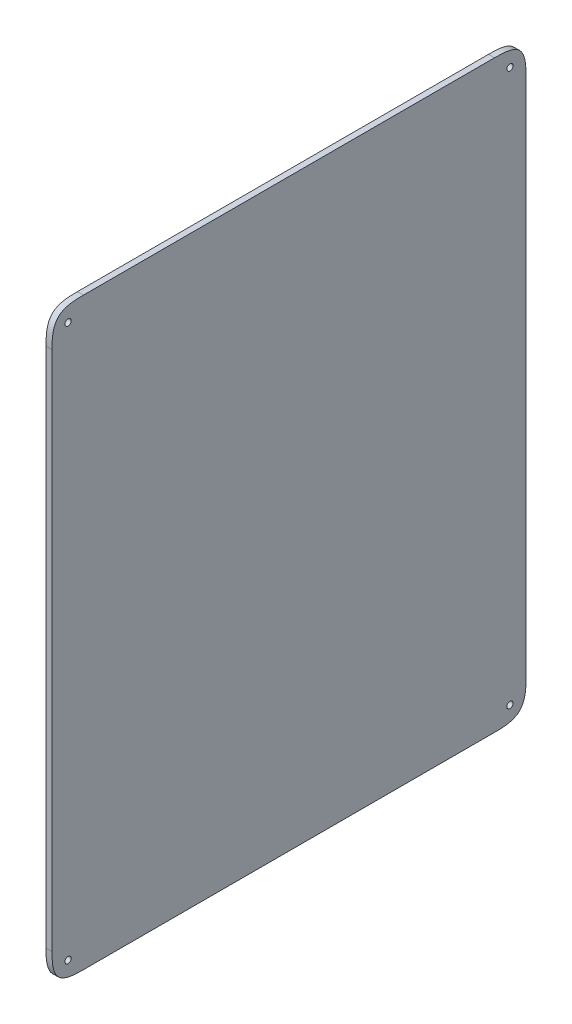
ISO-10303-21;
HEADER;
FILE_DESCRIPTION(('STEP AP214'),'2;1');
FILE_NAME('part.step','',(''),(''),'','','');
FILE_SCHEMA(('AUTOMOTIVE_DESIGN { 1 0 10303 214 1 1 1 1 }'));
ENDSEC;
DATA;
#1=APPLICATION_CONTEXT('core data for automotive mechanical design processes');
#2=APPLICATION_PROTOCOL_DEFINITION('international standard','automotive_design',2000,#1);
#3=PRODUCT_CONTEXT('',#1,'mechanical');
#4=PRODUCT('Part','Part','',(#3));
#5=PRODUCT_RELATED_PRODUCT_CATEGORY('part','',(#4));
#6=PRODUCT_DEFINITION_FORMATION('','',#4);
#7=PRODUCT_DEFINITION_CONTEXT('part definition',#1,'design');
#8=PRODUCT_DEFINITION('design','',#6,#7);
#9=PRODUCT_DEFINITION_SHAPE('','',#8);
#10=(LENGTH_UNIT() NAMED_UNIT(*) SI_UNIT(.MILLI.,.METRE.));
#11=(NAMED_UNIT(*) PLANE_ANGLE_UNIT() SI_UNIT($,.RADIAN.));
#12=(NAMED_UNIT(*) SI_UNIT($,.STERADIAN.) SOLID_ANGLE_UNIT());
#13=UNCERTAINTY_MEASURE_WITH_UNIT(LENGTH_MEASURE(1.E-05),#10,'distance_accuracy_value','');
#14=(GEOMETRIC_REPRESENTATION_CONTEXT(3) GLOBAL_UNCERTAINTY_ASSIGNED_CONTEXT((#13)) GLOBAL_UNIT_ASSIGNED_CONTEXT((#10,
#11,#12)) REPRESENTATION_CONTEXT('',''));
#15=CARTESIAN_POINT('',(0.,0.,0.));
#16=DIRECTION('',(0.,0.,1.));
#17=DIRECTION('',(1.,0.,0.));
#18=AXIS2_PLACEMENT_3D('',#15,#16,#17);
#19=CARTESIAN_POINT('',(134.,260.,-236.399999999949));
#20=CARTESIAN_POINT('',(134.,262.209802254566,-236.399999999949));
#21=CARTESIAN_POINT('',(134.,264.418959698798,-236.391924275158));
#22=CARTESIAN_POINT('',(134.,268.821858168656,-236.182694726137));
#23=CARTESIAN_POINT('',(134.,271.015648283181,-235.982155700431));
#24=CARTESIAN_POINT('',(134.,274.283308196084,-235.392974528868));
#25=CARTESIAN_POINT('',(134.,275.373662547497,-235.148476846611));
#26=CARTESIAN_POINT('',(134.,277.509476267589,-234.544783131068));
#27=CARTESIAN_POINT('',(134.,278.556691748358,-234.185747806904));
#28=CARTESIAN_POINT('',(134.,280.087422813137,-233.536384955998));
#29=CARTESIAN_POINT('',(134.,280.590989349973,-233.301475834499));
#30=CARTESIAN_POINT('',(134.,281.58191965689,-232.786875106502));
#31=CARTESIAN_POINT('',(134.,282.064606703442,-232.509425167226));
#32=CARTESIAN_POINT('',(134.,283.462712715823,-231.614502901654));
#33=CARTESIAN_POINT('',(134.,284.330406983879,-230.931694464145));
#34=CARTESIAN_POINT('',(134.,285.317310668698,-229.947354407118));
#35=CARTESIAN_POINT('',(134.,285.510060370963,-229.74298015577));
#36=CARTESIAN_POINT('',(134.,285.881111421205,-229.325995196019));
#37=CARTESIAN_POINT('',(134.,286.05989077758,-229.113001724201));
#38=CARTESIAN_POINT('',(134.,286.577601069868,-228.461592999204));
#39=CARTESIAN_POINT('',(134.,286.897979862802,-228.010799898805));
#40=CARTESIAN_POINT('',(134.,287.495597815756,-227.080431266467));
#41=CARTESIAN_POINT('',(134.,287.772814501515,-226.600840739874));
#42=CARTESIAN_POINT('',(134.,288.288259306468,-225.61564681471));
#43=CARTESIAN_POINT('',(134.,288.526833362248,-225.108597415131));
#44=CARTESIAN_POINT('',(134.,289.178807664599,-223.575631201994));
#45=CARTESIAN_POINT('',(134.,289.53700371739,-222.532045947294));
#46=CARTESIAN_POINT('',(134.,290.138588923947,-220.412427967028));
#47=CARTESIAN_POINT('',(134.,290.381719550955,-219.336322174952));
#48=CARTESIAN_POINT('',(134.,290.777698803418,-217.158594505615));
#49=CARTESIAN_POINT('',(134.,290.92910988561,-216.055084851738));
#50=CARTESIAN_POINT('',(134.,291.157191821873,-213.850690762166));
#51=CARTESIAN_POINT('',(134.,291.234600973875,-212.746681909609));
#52=CARTESIAN_POINT('',(134.,291.392859763278,-209.430996865435));
#53=CARTESIAN_POINT('',(134.,291.399999999898,-207.215675010588));
#54=CARTESIAN_POINT('',(134.,291.399999999898,-205.));
#55=B_SPLINE_CURVE_WITH_KNOTS('',3,(#19,#20,#21,#22,#23,#24,#25,#26,#27,#28,#29,#30,#31,#32,#33,
#34,#35,#36,#37,#38,#39,#40,#41,#42,#43,#44,#45,#46,#47,#48,#49,#50,#51,#52,#53,#54),
.UNSPECIFIED.,.F.,.F.,(4,2,2,2,2,2,2,2,2,2,2,2,2,2,2,2,2,4),(0.,0.124999999999992,
0.249999999999984,0.312499999999982,0.374999999999979,0.40624999999998,0.43749999999998,
0.499999999999981,0.51562499999998,0.53124999999998,0.56249999999998,0.59374999999998,
0.624999999999981,0.687499999999984,0.749999999999987,0.81249999999999,0.874999999999994,1.),.UNSPECIFIED.);
#56=DIRECTION('',(1.,0.,0.));
#57=VECTOR('',#56,1.);
#58=SURFACE_OF_LINEAR_EXTRUSION('',#55,#57);
#59=CARTESIAN_POINT('',(140.,291.399999999898,-205.));
#60=CARTESIAN_POINT('',(140.,291.399999999898,-207.215675010588));
#61=CARTESIAN_POINT('',(140.,291.392859763278,-209.430996865435));
#62=CARTESIAN_POINT('',(140.,291.234600973875,-212.746681909609));
#63=CARTESIAN_POINT('',(140.,291.157191821873,-213.850690762166));
#64=CARTESIAN_POINT('',(140.,290.92910988561,-216.055084851738));
#65=CARTESIAN_POINT('',(140.,290.777698803418,-217.158594505615));
#66=CARTESIAN_POINT('',(140.,290.381719550955,-219.336322174952));
#67=CARTESIAN_POINT('',(140.,290.138588923947,-220.412427967028));
#68=CARTESIAN_POINT('',(140.,289.53700371739,-222.532045947294));
#69=CARTESIAN_POINT('',(140.,289.178807664599,-223.575631201994));
#70=CARTESIAN_POINT('',(140.,288.526833362248,-225.108597415131));
#71=CARTESIAN_POINT('',(140.,288.288259306468,-225.61564681471));
#72=CARTESIAN_POINT('',(140.,287.772814501515,-226.600840739874));
#73=CARTESIAN_POINT('',(140.,287.495597815756,-227.080431266467));
#74=CARTESIAN_POINT('',(140.,286.897979862802,-228.010799898805));
#75=CARTESIAN_POINT('',(140.,286.577601069868,-228.461592999204));
#76=CARTESIAN_POINT('',(140.,286.05989077758,-229.113001724201));
#77=CARTESIAN_POINT('',(140.,285.881111421205,-229.325995196019));
#78=CARTESIAN_POINT('',(140.,285.510060370963,-229.74298015577));
#79=CARTESIAN_POINT('',(140.,285.317310668698,-229.947354407118));
#80=CARTESIAN_POINT('',(140.,284.330406983879,-230.931694464145));
#81=CARTESIAN_POINT('',(140.,283.462712715823,-231.614502901654));
#82=CARTESIAN_POINT('',(140.,282.064606703442,-232.509425167226));
#83=CARTESIAN_POINT('',(140.,281.58191965689,-232.786875106502));
#84=CARTESIAN_POINT('',(140.,280.590989349973,-233.301475834499));
#85=CARTESIAN_POINT('',(140.,280.087422813137,-233.536384955998));
#86=CARTESIAN_POINT('',(140.,278.556691748358,-234.185747806904));
#87=CARTESIAN_POINT('',(140.,277.509476267589,-234.544783131068));
#88=CARTESIAN_POINT('',(140.,275.373662547497,-235.148476846611));
#89=CARTESIAN_POINT('',(140.,274.283308196084,-235.392974528868));
#90=CARTESIAN_POINT('',(140.,271.015648283181,-235.982155700431));
#91=CARTESIAN_POINT('',(140.,268.821858168656,-236.182694726137));
#92=CARTESIAN_POINT('',(140.,264.418959698798,-236.391924275158));
#93=CARTESIAN_POINT('',(140.,262.209802254566,-236.399999999949));
#94=CARTESIAN_POINT('',(140.,260.,-236.399999999949));
#95=B_SPLINE_CURVE_WITH_KNOTS('',3,(#59,#60,#61,#62,#63,#64,#65,#66,#67,#68,#69,#70,#71,#72,#73,
#74,#75,#76,#77,#78,#79,#80,#81,#82,#83,#84,#85,#86,#87,#88,#89,#90,#91,#92,#93,#94),
.UNSPECIFIED.,.F.,.F.,(4,2,2,2,2,2,2,2,2,2,2,2,2,2,2,2,2,4),(0.,0.125000000000006,
0.18750000000001,0.250000000000013,0.312500000000016,0.375000000000019,0.40625000000002,
0.43750000000002,0.46875000000002,0.48437500000002,0.500000000000019,0.56250000000002,
0.59375000000002,0.625000000000021,0.687500000000018,0.750000000000016,0.875000000000008,1.),.UNSPECIFIED.);
#96=CARTESIAN_POINT('',(140.,260.,-236.399999999949));
#97=VERTEX_POINT('',#96);
#98=CARTESIAN_POINT('',(140.,291.399999999898,-205.));
#99=VERTEX_POINT('',#98);
#100=EDGE_CURVE('E331',#97,#99,#95,.F.);
#101=ORIENTED_EDGE('',*,*,#100,.F.);
#102=DIRECTION('',(1.,0.,0.));
#103=VECTOR('',#102,1.);
#104=CARTESIAN_POINT('',(134.,260.,-236.399999999949));
#105=LINE('',#104,#103);
#106=CARTESIAN_POINT('',(134.,260.,-236.399999999949));
#107=VERTEX_POINT('',#106);
#108=EDGE_CURVE('E11',#107,#97,#105,.T.);
#109=ORIENTED_EDGE('',*,*,#108,.F.);
#110=CARTESIAN_POINT('',(134.,260.,-236.399999999949));
#111=CARTESIAN_POINT('',(134.,262.209802254566,-236.399999999949));
#112=CARTESIAN_POINT('',(134.,264.418959698798,-236.391924275158));
#113=CARTESIAN_POINT('',(134.,268.821858168656,-236.182694726137));
#114=CARTESIAN_POINT('',(134.,271.015648283181,-235.982155700431));
#115=CARTESIAN_POINT('',(134.,274.283308196084,-235.392974528868));
#116=CARTESIAN_POINT('',(134.,275.373662547497,-235.148476846611));
#117=CARTESIAN_POINT('',(134.,277.509476267589,-234.544783131068));
#118=CARTESIAN_POINT('',(134.,278.556691748358,-234.185747806904));
#119=CARTESIAN_POINT('',(134.,280.087422813137,-233.536384955998));
#120=CARTESIAN_POINT('',(134.,280.590989349973,-233.301475834499));
#121=CARTESIAN_POINT('',(134.,281.58191965689,-232.786875106502));
#122=CARTESIAN_POINT('',(134.,282.064606703442,-232.509425167226));
#123=CARTESIAN_POINT('',(134.,283.462712715823,-231.614502901654));
#124=CARTESIAN_POINT('',(134.,284.330406983879,-230.931694464145));
#125=CARTESIAN_POINT('',(134.,285.317310668698,-229.947354407118));
#126=CARTESIAN_POINT('',(134.,285.510060370963,-229.74298015577));
#127=CARTESIAN_POINT('',(134.,285.881111421205,-229.325995196019));
#128=CARTESIAN_POINT('',(134.,286.05989077758,-229.113001724201));
#129=CARTESIAN_POINT('',(134.,286.577601069868,-228.461592999204));
#130=CARTESIAN_POINT('',(134.,286.897979862802,-228.010799898805));
#131=CARTESIAN_POINT('',(134.,287.495597815756,-227.080431266467));
#132=CARTESIAN_POINT('',(134.,287.772814501515,-226.600840739874));
#133=CARTESIAN_POINT('',(134.,288.288259306468,-225.61564681471));
#134=CARTESIAN_POINT('',(134.,288.526833362248,-225.108597415131));
#135=CARTESIAN_POINT('',(134.,289.178807664599,-223.575631201994));
#136=CARTESIAN_POINT('',(134.,289.53700371739,-222.532045947294));
#137=CARTESIAN_POINT('',(134.,290.138588923947,-220.412427967028));
#138=CARTESIAN_POINT('',(134.,290.381719550955,-219.336322174952));
#139=CARTESIAN_POINT('',(134.,290.777698803418,-217.158594505615));
#140=CARTESIAN_POINT('',(134.,290.92910988561,-216.055084851738));
#141=CARTESIAN_POINT('',(134.,291.157191821873,-213.850690762166));
#142=CARTESIAN_POINT('',(134.,291.234600973875,-212.746681909609));
#143=CARTESIAN_POINT('',(134.,291.392859763278,-209.430996865435));
#144=CARTESIAN_POINT('',(134.,291.399999999898,-207.215675010588));
#145=CARTESIAN_POINT('',(134.,291.399999999898,-205.));
#146=B_SPLINE_CURVE_WITH_KNOTS('',3,(#110,#111,#112,#113,#114,#115,#116,#117,#118,#119,#120,
#121,#122,#123,#124,#125,#126,#127,#128,#129,#130,#131,#132,#133,#134,#135,#136,#137,#138,#139,
#140,#141,#142,#143,#144,#145),.UNSPECIFIED.,.F.,.F.,(4,2,2,2,2,2,2,2,2,2,2,2,2,2,2,2,2,4),(0.,
0.124999999999992,0.249999999999984,0.312499999999982,0.374999999999979,0.40624999999998,
0.43749999999998,0.499999999999981,0.51562499999998,0.53124999999998,0.56249999999998,
0.59374999999998,0.624999999999981,0.687499999999984,0.749999999999987,0.81249999999999,
0.874999999999994,1.),.UNSPECIFIED.);
#147=CARTESIAN_POINT('',(134.,291.399999999898,-205.));
#148=VERTEX_POINT('',#147);
#149=EDGE_CURVE('E299',#107,#148,#146,.T.);
#150=ORIENTED_EDGE('',*,*,#149,.T.);
#151=DIRECTION('',(1.,0.,0.));
#152=VECTOR('',#151,1.);
#153=CARTESIAN_POINT('',(134.,291.399999999898,-205.));
#154=LINE('',#153,#152);
#155=EDGE_CURVE('E100',#148,#99,#154,.T.);
#156=ORIENTED_EDGE('',*,*,#155,.T.);
#157=EDGE_LOOP('',(#101,#109,#150,#156));
#158=FACE_BOUND('',#157,.T.);
#159=ADVANCED_FACE('F41',(#158),#58,.T.);
#160=CARTESIAN_POINT('',(134.,-260.,-236.399999999949));
#161=DIRECTION('',(0.,0.,-1.));
#162=DIRECTION('',(0.,1.,0.));
#163=AXIS2_PLACEMENT_3D('',#160,#161,#162);
#164=PLANE('',#163);
#165=DIRECTION('',(0.,1.,0.));
#166=VECTOR('',#165,1.);
#167=CARTESIAN_POINT('',(140.,-260.,-236.399999999949));
#168=LINE('',#167,#166);
#169=CARTESIAN_POINT('',(140.,-260.,-236.399999999949));
#170=VERTEX_POINT('',#169);
#171=EDGE_CURVE('E323',#170,#97,#168,.T.);
#172=ORIENTED_EDGE('',*,*,#171,.F.);
#173=DIRECTION('',(1.,0.,0.));
#174=VECTOR('',#173,1.);
#175=CARTESIAN_POINT('',(134.,-260.,-236.399999999949));
#176=LINE('',#175,#174);
#177=CARTESIAN_POINT('',(134.,-260.,-236.399999999949));
#178=VERTEX_POINT('',#177);
#179=EDGE_CURVE('E53',#178,#170,#176,.T.);
#180=ORIENTED_EDGE('',*,*,#179,.F.);
#181=DIRECTION('',(0.,1.,0.));
#182=VECTOR('',#181,1.);
#183=CARTESIAN_POINT('',(134.,-260.,-236.399999999949));
#184=LINE('',#183,#182);
#185=EDGE_CURVE('E135',#178,#107,#184,.T.);
#186=ORIENTED_EDGE('',*,*,#185,.T.);
#187=ORIENTED_EDGE('',*,*,#108,.T.);
#188=EDGE_LOOP('',(#172,#180,#186,#187));
#189=FACE_BOUND('',#188,.T.);
#190=ADVANCED_FACE('F174',(#189),#164,.T.);
#191=CARTESIAN_POINT('',(134.,-291.4,-205.));
#192=CARTESIAN_POINT('',(134.,-291.4,-207.209802254541));
#193=CARTESIAN_POINT('',(134.,-291.391924275225,-209.418959698749));
#194=CARTESIAN_POINT('',(134.,-291.182694726235,-213.821858168556));
#195=CARTESIAN_POINT('',(134.,-290.982155700547,-216.015648283055));
#196=CARTESIAN_POINT('',(134.,-290.392974528948,-219.283308195909));
#197=CARTESIAN_POINT('',(134.,-290.148476846701,-220.37366254731));
#198=CARTESIAN_POINT('',(134.,-289.544783131192,-222.509476267403));
#199=CARTESIAN_POINT('',(134.,-289.185747807052,-223.556691748171));
#200=CARTESIAN_POINT('',(134.,-288.536384956161,-225.087422812935));
#201=CARTESIAN_POINT('',(134.,-288.301475834679,-225.59098934977));
#202=CARTESIAN_POINT('',(134.,-287.786875106722,-226.581919656684));
#203=CARTESIAN_POINT('',(134.,-287.509425167455,-227.064606703253));
#204=CARTESIAN_POINT('',(134.,-286.614502901851,-228.462712715596));
#205=CARTESIAN_POINT('',(134.,-285.931694464486,-229.33040698374));
#206=CARTESIAN_POINT('',(134.,-284.947354407414,-230.317310668486));
#207=CARTESIAN_POINT('',(134.,-284.742980156059,-230.51006037074));
#208=CARTESIAN_POINT('',(134.,-284.325995196295,-230.88111142098));
#209=CARTESIAN_POINT('',(134.,-284.113001724475,-231.059890777359));
#210=CARTESIAN_POINT('',(134.,-283.461592999477,-231.577601069669));
#211=CARTESIAN_POINT('',(134.,-283.010799899086,-231.897979862629));
#212=CARTESIAN_POINT('',(134.,-282.080431266767,-232.495597815635));
#213=CARTESIAN_POINT('',(134.,-281.600840740183,-232.772814501421));
#214=CARTESIAN_POINT('',(134.,-280.61564681503,-233.288259306408));
#215=CARTESIAN_POINT('',(134.,-280.108597415445,-233.526833362195));
#216=CARTESIAN_POINT('',(134.,-278.57563120228,-234.178807664527));
#217=CARTESIAN_POINT('',(134.,-277.532045947584,-234.537003717378));
#218=CARTESIAN_POINT('',(134.,-275.412427967317,-235.138588924011));
#219=CARTESIAN_POINT('',(134.,-274.336322175236,-235.381719551033));
#220=CARTESIAN_POINT('',(134.,-272.158594505847,-235.777698803361));
#221=CARTESIAN_POINT('',(134.,-271.055084851951,-235.929109885522));
#222=CARTESIAN_POINT('',(134.,-268.850690762334,-236.15719182177));
#223=CARTESIAN_POINT('',(134.,-267.746681909756,-236.234600973786));
#224=CARTESIAN_POINT('',(134.,-264.43099686552,-236.392859763255));
#225=CARTESIAN_POINT('',(134.,-262.215675010633,-236.399999999949));
#226=CARTESIAN_POINT('',(134.,-260.,-236.399999999949));
#227=B_SPLINE_CURVE_WITH_KNOTS('',3,(#191,#192,#193,#194,#195,#196,#197,#198,#199,#200,#201,
#202,#203,#204,#205,#206,#207,#208,#209,#210,#211,#212,#213,#214,#215,#216,#217,#218,#219,#220,
#221,#222,#223,#224,#225,#226),.UNSPECIFIED.,.F.,.F.,(4,2,2,2,2,2,2,2,2,2,2,2,2,2,2,2,2,4),(0.,
0.125000000000011,0.250000000000022,0.312500000000027,0.375000000000031,0.406250000000033,
0.437500000000035,0.500000000000037,0.515625000000036,0.531250000000035,0.562500000000032,
0.593750000000028,0.625000000000024,0.68750000000002,0.750000000000016,0.812500000000012,
0.875000000000008,1.),.UNSPECIFIED.);
#228=DIRECTION('',(1.,0.,0.));
#229=VECTOR('',#228,1.);
#230=SURFACE_OF_LINEAR_EXTRUSION('',#227,#229);
#231=CARTESIAN_POINT('',(140.,-260.,-236.399999999949));
#232=CARTESIAN_POINT('',(140.,-262.215675010633,-236.399999999949));
#233=CARTESIAN_POINT('',(140.,-264.43099686552,-236.392859763255));
#234=CARTESIAN_POINT('',(140.,-267.746681909756,-236.234600973786));
#235=CARTESIAN_POINT('',(140.,-268.850690762334,-236.15719182177));
#236=CARTESIAN_POINT('',(140.,-271.055084851951,-235.929109885522));
#237=CARTESIAN_POINT('',(140.,-272.158594505847,-235.777698803361));
#238=CARTESIAN_POINT('',(140.,-274.336322175236,-235.381719551033));
#239=CARTESIAN_POINT('',(140.,-275.412427967317,-235.138588924011));
#240=CARTESIAN_POINT('',(140.,-277.532045947584,-234.537003717378));
#241=CARTESIAN_POINT('',(140.,-278.57563120228,-234.178807664527));
#242=CARTESIAN_POINT('',(140.,-280.108597415445,-233.526833362195));
#243=CARTESIAN_POINT('',(140.,-280.61564681503,-233.288259306408));
#244=CARTESIAN_POINT('',(140.,-281.600840740183,-232.772814501421));
#245=CARTESIAN_POINT('',(140.,-282.080431266767,-232.495597815635));
#246=CARTESIAN_POINT('',(140.,-283.010799899086,-231.897979862629));
#247=CARTESIAN_POINT('',(140.,-283.461592999477,-231.577601069669));
#248=CARTESIAN_POINT('',(140.,-284.113001724475,-231.059890777359));
#249=CARTESIAN_POINT('',(140.,-284.325995196295,-230.88111142098));
#250=CARTESIAN_POINT('',(140.,-284.742980156059,-230.51006037074));
#251=CARTESIAN_POINT('',(140.,-284.947354407414,-230.317310668486));
#252=CARTESIAN_POINT('',(140.,-285.931694464486,-229.33040698374));
#253=CARTESIAN_POINT('',(140.,-286.614502901851,-228.462712715596));
#254=CARTESIAN_POINT('',(140.,-287.509425167455,-227.064606703253));
#255=CARTESIAN_POINT('',(140.,-287.786875106722,-226.581919656684));
#256=CARTESIAN_POINT('',(140.,-288.301475834679,-225.59098934977));
#257=CARTESIAN_POINT('',(140.,-288.536384956161,-225.087422812935));
#258=CARTESIAN_POINT('',(140.,-289.185747807052,-223.556691748171));
#259=CARTESIAN_POINT('',(140.,-289.544783131192,-222.509476267403));
#260=CARTESIAN_POINT('',(140.,-290.148476846701,-220.37366254731));
#261=CARTESIAN_POINT('',(140.,-290.392974528948,-219.283308195909));
#262=CARTESIAN_POINT('',(140.,-290.982155700547,-216.015648283055));
#263=CARTESIAN_POINT('',(140.,-291.182694726235,-213.821858168556));
#264=CARTESIAN_POINT('',(140.,-291.391924275225,-209.418959698749));
#265=CARTESIAN_POINT('',(140.,-291.4,-207.209802254541));
#266=CARTESIAN_POINT('',(140.,-291.4,-205.));
#267=B_SPLINE_CURVE_WITH_KNOTS('',3,(#231,#232,#233,#234,#235,#236,#237,#238,#239,#240,#241,
#242,#243,#244,#245,#246,#247,#248,#249,#250,#251,#252,#253,#254,#255,#256,#257,#258,#259,#260,
#261,#262,#263,#264,#265,#266),.UNSPECIFIED.,.F.,.F.,(4,2,2,2,2,2,2,2,2,2,2,2,2,2,2,2,2,4),(0.,
0.124999999999992,0.187499999999988,0.249999999999984,0.31249999999998,0.374999999999976,
0.406249999999972,0.437499999999968,0.468749999999965,0.484374999999964,0.499999999999963,
0.562499999999965,0.593749999999967,0.624999999999969,0.687499999999973,0.749999999999978,
0.874999999999989,1.),.UNSPECIFIED.);
#268=CARTESIAN_POINT('',(140.,-291.4,-205.));
#269=VERTEX_POINT('',#268);
#270=EDGE_CURVE('E120',#269,#170,#267,.F.);
#271=ORIENTED_EDGE('',*,*,#270,.F.);
#272=DIRECTION('',(1.,0.,0.));
#273=VECTOR('',#272,1.);
#274=CARTESIAN_POINT('',(134.,-291.4,-205.));
#275=LINE('',#274,#273);
#276=CARTESIAN_POINT('',(134.,-291.4,-205.));
#277=VERTEX_POINT('',#276);
#278=EDGE_CURVE('E114',#277,#269,#275,.T.);
#279=ORIENTED_EDGE('',*,*,#278,.F.);
#280=CARTESIAN_POINT('',(134.,-291.4,-205.));
#281=CARTESIAN_POINT('',(134.,-291.4,-207.209802254541));
#282=CARTESIAN_POINT('',(134.,-291.391924275225,-209.418959698749));
#283=CARTESIAN_POINT('',(134.,-291.182694726235,-213.821858168556));
#284=CARTESIAN_POINT('',(134.,-290.982155700547,-216.015648283055));
#285=CARTESIAN_POINT('',(134.,-290.392974528948,-219.283308195909));
#286=CARTESIAN_POINT('',(134.,-290.148476846701,-220.37366254731));
#287=CARTESIAN_POINT('',(134.,-289.544783131192,-222.509476267403));
#288=CARTESIAN_POINT('',(134.,-289.185747807052,-223.556691748171));
#289=CARTESIAN_POINT('',(134.,-288.536384956161,-225.087422812935));
#290=CARTESIAN_POINT('',(134.,-288.301475834679,-225.59098934977));
#291=CARTESIAN_POINT('',(134.,-287.786875106722,-226.581919656684));
#292=CARTESIAN_POINT('',(134.,-287.509425167455,-227.064606703253));
#293=CARTESIAN_POINT('',(134.,-286.614502901851,-228.462712715596));
#294=CARTESIAN_POINT('',(134.,-285.931694464486,-229.33040698374));
#295=CARTESIAN_POINT('',(134.,-284.947354407414,-230.317310668486));
#296=CARTESIAN_POINT('',(134.,-284.742980156059,-230.51006037074));
#297=CARTESIAN_POINT('',(134.,-284.325995196295,-230.88111142098));
#298=CARTESIAN_POINT('',(134.,-284.113001724475,-231.059890777359));
#299=CARTESIAN_POINT('',(134.,-283.461592999477,-231.577601069669));
#300=CARTESIAN_POINT('',(134.,-283.010799899086,-231.897979862629));
#301=CARTESIAN_POINT('',(134.,-282.080431266767,-232.495597815635));
#302=CARTESIAN_POINT('',(134.,-281.600840740183,-232.772814501421));
#303=CARTESIAN_POINT('',(134.,-280.61564681503,-233.288259306408));
#304=CARTESIAN_POINT('',(134.,-280.108597415445,-233.526833362195));
#305=CARTESIAN_POINT('',(134.,-278.57563120228,-234.178807664527));
#306=CARTESIAN_POINT('',(134.,-277.532045947584,-234.537003717378));
#307=CARTESIAN_POINT('',(134.,-275.412427967317,-235.138588924011));
#308=CARTESIAN_POINT('',(134.,-274.336322175236,-235.381719551033));
#309=CARTESIAN_POINT('',(134.,-272.158594505847,-235.777698803361));
#310=CARTESIAN_POINT('',(134.,-271.055084851951,-235.929109885522));
#311=CARTESIAN_POINT('',(134.,-268.850690762334,-236.15719182177));
#312=CARTESIAN_POINT('',(134.,-267.746681909756,-236.234600973786));
#313=CARTESIAN_POINT('',(134.,-264.43099686552,-236.392859763255));
#314=CARTESIAN_POINT('',(134.,-262.215675010633,-236.399999999949));
#315=CARTESIAN_POINT('',(134.,-260.,-236.399999999949));
#316=B_SPLINE_CURVE_WITH_KNOTS('',3,(#280,#281,#282,#283,#284,#285,#286,#287,#288,#289,#290,
#291,#292,#293,#294,#295,#296,#297,#298,#299,#300,#301,#302,#303,#304,#305,#306,#307,#308,#309,
#310,#311,#312,#313,#314,#315),.UNSPECIFIED.,.F.,.F.,(4,2,2,2,2,2,2,2,2,2,2,2,2,2,2,2,2,4),(0.,
0.125000000000011,0.250000000000022,0.312500000000027,0.375000000000031,0.406250000000033,
0.437500000000035,0.500000000000037,0.515625000000036,0.531250000000035,0.562500000000032,
0.593750000000028,0.625000000000024,0.68750000000002,0.750000000000016,0.812500000000012,
0.875000000000008,1.),.UNSPECIFIED.);
#317=EDGE_CURVE('E117',#277,#178,#316,.T.);
#318=ORIENTED_EDGE('',*,*,#317,.T.);
#319=ORIENTED_EDGE('',*,*,#179,.T.);
#320=EDGE_LOOP('',(#271,#279,#318,#319));
#321=FACE_BOUND('',#320,.T.);
#322=ADVANCED_FACE('F116',(#321),#230,.T.);
#323=CARTESIAN_POINT('',(134.,-291.4,205.));
#324=DIRECTION('',(0.,-1.,0.));
#325=DIRECTION('',(0.,0.,-1.));
#326=AXIS2_PLACEMENT_3D('',#323,#324,#325);
#327=PLANE('',#326);
#328=DIRECTION('',(0.,0.,-1.));
#329=VECTOR('',#328,1.);
#330=CARTESIAN_POINT('',(140.,-291.4,205.));
#331=LINE('',#330,#329);
#332=CARTESIAN_POINT('',(140.,-291.4,205.));
#333=VERTEX_POINT('',#332);
#334=EDGE_CURVE('E321',#333,#269,#331,.T.);
#335=ORIENTED_EDGE('',*,*,#334,.F.);
#336=DIRECTION('',(1.,0.,0.));
#337=VECTOR('',#336,1.);
#338=CARTESIAN_POINT('',(134.,-291.4,205.));
#339=LINE('',#338,#337);
#340=CARTESIAN_POINT('',(134.,-291.4,205.));
#341=VERTEX_POINT('',#340);
#342=EDGE_CURVE('E126',#341,#333,#339,.T.);
#343=ORIENTED_EDGE('',*,*,#342,.F.);
#344=DIRECTION('',(0.,0.,-1.));
#345=VECTOR('',#344,1.);
#346=CARTESIAN_POINT('',(134.,-291.4,205.));
#347=LINE('',#346,#345);
#348=EDGE_CURVE('E133',#341,#277,#347,.T.);
#349=ORIENTED_EDGE('',*,*,#348,.T.);
#350=ORIENTED_EDGE('',*,*,#278,.T.);
#351=EDGE_LOOP('',(#335,#343,#349,#350));
#352=FACE_BOUND('',#351,.T.);
#353=ADVANCED_FACE('F138',(#352),#327,.T.);
#354=CARTESIAN_POINT('',(134.,-260.,236.399999999949));
#355=CARTESIAN_POINT('',(134.,-262.209802254579,236.399999999949));
#356=CARTESIAN_POINT('',(134.,-264.418959698821,236.391924275121));
#357=CARTESIAN_POINT('',(134.,-268.8218581687,236.182694726063));
#358=CARTESIAN_POINT('',(134.,-271.015648283237,235.982155700356));
#359=CARTESIAN_POINT('',(134.,-274.283308196166,235.392974528905));
#360=CARTESIAN_POINT('',(134.,-275.373662547588,235.148476846657));
#361=CARTESIAN_POINT('',(134.,-277.509476267691,234.544783131091));
#362=CARTESIAN_POINT('',(134.,-278.556691748458,234.185747806901));
#363=CARTESIAN_POINT('',(134.,-280.087422813245,233.536384955997));
#364=CARTESIAN_POINT('',(134.,-280.590989350085,233.301475834505));
#365=CARTESIAN_POINT('',(134.,-281.581919657007,232.786875106516));
#366=CARTESIAN_POINT('',(134.,-282.064606703568,232.509425167237));
#367=CARTESIAN_POINT('',(134.,-283.462712715923,231.614502901614));
#368=CARTESIAN_POINT('',(134.,-284.330406983975,230.931694464095));
#369=CARTESIAN_POINT('',(134.,-285.317310668822,229.947354407107));
#370=CARTESIAN_POINT('',(134.,-285.510060371093,229.742980155764));
#371=CARTESIAN_POINT('',(134.,-285.88111142134,229.325995196017));
#372=CARTESIAN_POINT('',(134.,-286.059890777715,229.1130017242));
#373=CARTESIAN_POINT('',(134.,-286.577601069999,228.461592999202));
#374=CARTESIAN_POINT('',(134.,-286.897979862925,228.0107998988));
#375=CARTESIAN_POINT('',(134.,-287.495597815861,227.080431266456));
#376=CARTESIAN_POINT('',(134.,-287.772814501611,226.60084073986));
#377=CARTESIAN_POINT('',(134.,-288.288259306556,225.6156468147));
#378=CARTESIAN_POINT('',(134.,-288.526833362337,225.108597415126));
#379=CARTESIAN_POINT('',(134.,-289.178807664728,223.575631202013));
#380=CARTESIAN_POINT('',(134.,-289.537003717575,222.532045947337));
#381=CARTESIAN_POINT('',(134.,-290.138588924169,220.412427967097));
#382=CARTESIAN_POINT('',(134.,-290.381719551154,219.336322175022));
#383=CARTESIAN_POINT('',(134.,-290.777698803397,217.158594505639));
#384=CARTESIAN_POINT('',(134.,-290.929109885534,216.05508485176));
#385=CARTESIAN_POINT('',(134.,-291.157191821759,213.850690762182));
#386=CARTESIAN_POINT('',(134.,-291.234600973778,212.746681909624));
#387=CARTESIAN_POINT('',(134.,-291.392859763269,209.430996865446));
#388=CARTESIAN_POINT('',(134.,-291.4,207.215675010596));
#389=CARTESIAN_POINT('',(134.,-291.4,205.));
#390=B_SPLINE_CURVE_WITH_KNOTS('',3,(#354,#355,#356,#357,#358,#359,#360,#361,#362,#363,#364,
#365,#366,#367,#368,#369,#370,#371,#372,#373,#374,#375,#376,#377,#378,#379,#380,#381,#382,#383,
#384,#385,#386,#387,#388,#389),.UNSPECIFIED.,.F.,.F.,(4,2,2,2,2,2,2,2,2,2,2,2,2,2,2,2,2,4),(0.,
0.125000000000007,0.250000000000014,0.312500000000016,0.375000000000018,0.406250000000017,
0.437500000000016,0.500000000000015,0.515625000000016,0.531250000000016,0.562500000000015,
0.593750000000014,0.625000000000013,0.68750000000001,0.750000000000008,0.812500000000006,
0.875000000000003,1.),.UNSPECIFIED.);
#391=DIRECTION('',(1.,0.,0.));
#392=VECTOR('',#391,1.);
#393=SURFACE_OF_LINEAR_EXTRUSION('',#390,#392);
#394=CARTESIAN_POINT('',(140.,-291.4,205.));
#395=CARTESIAN_POINT('',(140.,-291.4,207.215675010596));
#396=CARTESIAN_POINT('',(140.,-291.392859763269,209.430996865446));
#397=CARTESIAN_POINT('',(140.,-291.234600973778,212.746681909624));
#398=CARTESIAN_POINT('',(140.,-291.157191821759,213.850690762182));
#399=CARTESIAN_POINT('',(140.,-290.929109885534,216.05508485176));
#400=CARTESIAN_POINT('',(140.,-290.777698803397,217.158594505639));
#401=CARTESIAN_POINT('',(140.,-290.381719551154,219.336322175022));
#402=CARTESIAN_POINT('',(140.,-290.138588924169,220.412427967097));
#403=CARTESIAN_POINT('',(140.,-289.537003717575,222.532045947337));
#404=CARTESIAN_POINT('',(140.,-289.178807664728,223.575631202013));
#405=CARTESIAN_POINT('',(140.,-288.526833362337,225.108597415126));
#406=CARTESIAN_POINT('',(140.,-288.288259306556,225.6156468147));
#407=CARTESIAN_POINT('',(140.,-287.772814501611,226.60084073986));
#408=CARTESIAN_POINT('',(140.,-287.495597815861,227.080431266456));
#409=CARTESIAN_POINT('',(140.,-286.897979862925,228.0107998988));
#410=CARTESIAN_POINT('',(140.,-286.577601069999,228.461592999202));
#411=CARTESIAN_POINT('',(140.,-286.059890777715,229.1130017242));
#412=CARTESIAN_POINT('',(140.,-285.88111142134,229.325995196017));
#413=CARTESIAN_POINT('',(140.,-285.510060371093,229.742980155764));
#414=CARTESIAN_POINT('',(140.,-285.317310668822,229.947354407107));
#415=CARTESIAN_POINT('',(140.,-284.330406983975,230.931694464095));
#416=CARTESIAN_POINT('',(140.,-283.462712715923,231.614502901614));
#417=CARTESIAN_POINT('',(140.,-282.064606703568,232.509425167237));
#418=CARTESIAN_POINT('',(140.,-281.581919657007,232.786875106516));
#419=CARTESIAN_POINT('',(140.,-280.590989350085,233.301475834505));
#420=CARTESIAN_POINT('',(140.,-280.087422813245,233.536384955997));
#421=CARTESIAN_POINT('',(140.,-278.556691748458,234.185747806901));
#422=CARTESIAN_POINT('',(140.,-277.509476267691,234.544783131091));
#423=CARTESIAN_POINT('',(140.,-275.373662547588,235.148476846657));
#424=CARTESIAN_POINT('',(140.,-274.283308196166,235.392974528905));
#425=CARTESIAN_POINT('',(140.,-271.015648283237,235.982155700356));
#426=CARTESIAN_POINT('',(140.,-268.8218581687,236.182694726063));
#427=CARTESIAN_POINT('',(140.,-264.418959698821,236.391924275121));
#428=CARTESIAN_POINT('',(140.,-262.209802254579,236.399999999949));
#429=CARTESIAN_POINT('',(140.,-260.,236.399999999949));
#430=B_SPLINE_CURVE_WITH_KNOTS('',3,(#394,#395,#396,#397,#398,#399,#400,#401,#402,#403,#404,
#405,#406,#407,#408,#409,#410,#411,#412,#413,#414,#415,#416,#417,#418,#419,#420,#421,#422,#423,
#424,#425,#426,#427,#428,#429),.UNSPECIFIED.,.F.,.F.,(4,2,2,2,2,2,2,2,2,2,2,2,2,2,2,2,2,4),(0.,
0.124999999999997,0.187499999999994,0.249999999999992,0.31249999999999,0.374999999999987,
0.406249999999986,0.437499999999985,0.468749999999984,0.484374999999984,0.499999999999985,
0.562499999999984,0.593749999999983,0.624999999999982,0.687499999999984,0.749999999999986,
0.874999999999993,1.),.UNSPECIFIED.);
#431=CARTESIAN_POINT('',(140.,-260.,236.399999999949));
#432=VERTEX_POINT('',#431);
#433=EDGE_CURVE('E268',#432,#333,#430,.F.);
#434=ORIENTED_EDGE('',*,*,#433,.F.);
#435=DIRECTION('',(1.,0.,0.));
#436=VECTOR('',#435,1.);
#437=CARTESIAN_POINT('',(134.,-260.,236.399999999949));
#438=LINE('',#437,#436);
#439=CARTESIAN_POINT('',(134.,-260.,236.399999999949));
#440=VERTEX_POINT('',#439);
#441=EDGE_CURVE('E302',#440,#432,#438,.T.);
#442=ORIENTED_EDGE('',*,*,#441,.F.);
#443=CARTESIAN_POINT('',(134.,-260.,236.399999999949));
#444=CARTESIAN_POINT('',(134.,-262.209802254579,236.399999999949));
#445=CARTESIAN_POINT('',(134.,-264.418959698821,236.391924275121));
#446=CARTESIAN_POINT('',(134.,-268.8218581687,236.182694726063));
#447=CARTESIAN_POINT('',(134.,-271.015648283237,235.982155700356));
#448=CARTESIAN_POINT('',(134.,-274.283308196166,235.392974528905));
#449=CARTESIAN_POINT('',(134.,-275.373662547588,235.148476846657));
#450=CARTESIAN_POINT('',(134.,-277.509476267691,234.544783131091));
#451=CARTESIAN_POINT('',(134.,-278.556691748458,234.185747806901));
#452=CARTESIAN_POINT('',(134.,-280.087422813245,233.536384955997));
#453=CARTESIAN_POINT('',(134.,-280.590989350085,233.301475834505));
#454=CARTESIAN_POINT('',(134.,-281.581919657007,232.786875106516));
#455=CARTESIAN_POINT('',(134.,-282.064606703568,232.509425167237));
#456=CARTESIAN_POINT('',(134.,-283.462712715923,231.614502901614));
#457=CARTESIAN_POINT('',(134.,-284.330406983975,230.931694464095));
#458=CARTESIAN_POINT('',(134.,-285.317310668822,229.947354407107));
#459=CARTESIAN_POINT('',(134.,-285.510060371093,229.742980155764));
#460=CARTESIAN_POINT('',(134.,-285.88111142134,229.325995196017));
#461=CARTESIAN_POINT('',(134.,-286.059890777715,229.1130017242));
#462=CARTESIAN_POINT('',(134.,-286.577601069999,228.461592999202));
#463=CARTESIAN_POINT('',(134.,-286.897979862925,228.0107998988));
#464=CARTESIAN_POINT('',(134.,-287.495597815861,227.080431266456));
#465=CARTESIAN_POINT('',(134.,-287.772814501611,226.60084073986));
#466=CARTESIAN_POINT('',(134.,-288.288259306556,225.6156468147));
#467=CARTESIAN_POINT('',(134.,-288.526833362337,225.108597415126));
#468=CARTESIAN_POINT('',(134.,-289.178807664728,223.575631202013));
#469=CARTESIAN_POINT('',(134.,-289.537003717575,222.532045947337));
#470=CARTESIAN_POINT('',(134.,-290.138588924169,220.412427967097));
#471=CARTESIAN_POINT('',(134.,-290.381719551154,219.336322175022));
#472=CARTESIAN_POINT('',(134.,-290.777698803397,217.158594505639));
#473=CARTESIAN_POINT('',(134.,-290.929109885534,216.05508485176));
#474=CARTESIAN_POINT('',(134.,-291.157191821759,213.850690762182));
#475=CARTESIAN_POINT('',(134.,-291.234600973778,212.746681909624));
#476=CARTESIAN_POINT('',(134.,-291.392859763269,209.430996865446));
#477=CARTESIAN_POINT('',(134.,-291.4,207.215675010596));
#478=CARTESIAN_POINT('',(134.,-291.4,205.));
#479=B_SPLINE_CURVE_WITH_KNOTS('',3,(#443,#444,#445,#446,#447,#448,#449,#450,#451,#452,#453,
#454,#455,#456,#457,#458,#459,#460,#461,#462,#463,#464,#465,#466,#467,#468,#469,#470,#471,#472,
#473,#474,#475,#476,#477,#478),.UNSPECIFIED.,.F.,.F.,(4,2,2,2,2,2,2,2,2,2,2,2,2,2,2,2,2,4),(0.,
0.125000000000007,0.250000000000014,0.312500000000016,0.375000000000018,0.406250000000017,
0.437500000000016,0.500000000000015,0.515625000000016,0.531250000000016,0.562500000000015,
0.593750000000014,0.625000000000013,0.68750000000001,0.750000000000008,0.812500000000006,
0.875000000000003,1.),.UNSPECIFIED.);
#480=EDGE_CURVE('E139',#440,#341,#479,.T.);
#481=ORIENTED_EDGE('',*,*,#480,.T.);
#482=ORIENTED_EDGE('',*,*,#342,.T.);
#483=EDGE_LOOP('',(#434,#442,#481,#482));
#484=FACE_BOUND('',#483,.T.);
#485=ADVANCED_FACE('F244',(#484),#393,.T.);
#486=CARTESIAN_POINT('',(134.,260.,236.4));
#487=DIRECTION('',(0.,0.,1.));
#488=DIRECTION('',(0.,-1.,0.));
#489=AXIS2_PLACEMENT_3D('',#486,#487,#488);
#490=PLANE('',#489);
#491=DIRECTION('',(0.,-1.,0.));
#492=VECTOR('',#491,1.);
#493=CARTESIAN_POINT('',(140.,260.,236.4));
#494=LINE('',#493,#492);
#495=CARTESIAN_POINT('',(140.,260.,236.399999999949));
#496=VERTEX_POINT('',#495);
#497=EDGE_CURVE('E260',#496,#432,#494,.T.);
#498=ORIENTED_EDGE('',*,*,#497,.F.);
#499=DIRECTION('',(1.,0.,0.));
#500=VECTOR('',#499,1.);
#501=CARTESIAN_POINT('',(134.,260.,236.399999999949));
#502=LINE('',#501,#500);
#503=CARTESIAN_POINT('',(134.,260.,236.399999999949));
#504=VERTEX_POINT('',#503);
#505=EDGE_CURVE('E294',#504,#496,#502,.T.);
#506=ORIENTED_EDGE('',*,*,#505,.F.);
#507=DIRECTION('',(0.,-1.,0.));
#508=VECTOR('',#507,1.);
#509=CARTESIAN_POINT('',(134.,260.,236.4));
#510=LINE('',#509,#508);
#511=EDGE_CURVE('E141',#504,#440,#510,.T.);
#512=ORIENTED_EDGE('',*,*,#511,.T.);
#513=ORIENTED_EDGE('',*,*,#441,.T.);
#514=EDGE_LOOP('',(#498,#506,#512,#513));
#515=FACE_BOUND('',#514,.T.);
#516=ADVANCED_FACE('F219',(#515),#490,.T.);
#517=CARTESIAN_POINT('',(134.,291.4,205.));
#518=CARTESIAN_POINT('',(134.,291.4,207.209802254544));
#519=CARTESIAN_POINT('',(134.,291.391924275123,209.418959698746));
#520=CARTESIAN_POINT('',(134.,291.182694726135,213.821858168558));
#521=CARTESIAN_POINT('',(134.,290.982155700451,216.015648283059));
#522=CARTESIAN_POINT('',(134.,290.392974528842,219.283308195914));
#523=CARTESIAN_POINT('',(134.,290.148476846596,220.373662547314));
#524=CARTESIAN_POINT('',(134.,289.544783131094,222.509476267404));
#525=CARTESIAN_POINT('',(134.,289.185747806958,223.556691748172));
#526=CARTESIAN_POINT('',(134.,288.536384956057,225.087422812933));
#527=CARTESIAN_POINT('',(134.,288.301475834574,225.590989349768));
#528=CARTESIAN_POINT('',(134.,287.786875106619,226.581919656685));
#529=CARTESIAN_POINT('',(134.,287.509425167357,227.064606703249));
#530=CARTESIAN_POINT('',(134.,286.614502901755,228.462712715583));
#531=CARTESIAN_POINT('',(134.,285.931694464363,229.330406983703));
#532=CARTESIAN_POINT('',(134.,284.94735440733,230.317310668479));
#533=CARTESIAN_POINT('',(134.,284.742980155982,230.510060370739));
#534=CARTESIAN_POINT('',(134.,284.325995196233,230.881111420987));
#535=CARTESIAN_POINT('',(134.,284.11300172442,231.059890777369));
#536=CARTESIAN_POINT('',(134.,283.461592999441,231.577601069688));
#537=CARTESIAN_POINT('',(134.,283.010799899062,231.897979862652));
#538=CARTESIAN_POINT('',(134.,282.080431266761,232.495597815661));
#539=CARTESIAN_POINT('',(134.,281.600840740185,232.772814501445));
#540=CARTESIAN_POINT('',(134.,280.615646815035,233.288259306415));
#541=CARTESIAN_POINT('',(134.,280.108597415444,233.526833362183));
#542=CARTESIAN_POINT('',(134.,278.57563120225,234.178807664421));
#543=CARTESIAN_POINT('',(134.,277.532045947561,234.537003717283));
#544=CARTESIAN_POINT('',(134.,275.412427967321,235.13858892397));
#545=CARTESIAN_POINT('',(134.,274.33632217526,235.381719551033));
#546=CARTESIAN_POINT('',(134.,272.158594505878,235.777698803311));
#547=CARTESIAN_POINT('',(134.,271.055084851983,235.929109885458));
#548=CARTESIAN_POINT('',(134.,268.850690762356,236.157191821699));
#549=CARTESIAN_POINT('',(134.,267.746681909774,236.234600973722));
#550=CARTESIAN_POINT('',(134.,264.430996865528,236.392859763219));
#551=CARTESIAN_POINT('',(134.,262.215675010639,236.399999999949));
#552=CARTESIAN_POINT('',(134.,260.,236.399999999949));
#553=B_SPLINE_CURVE_WITH_KNOTS('',3,(#517,#518,#519,#520,#521,#522,#523,#524,#525,#526,#527,
#528,#529,#530,#531,#532,#533,#534,#535,#536,#537,#538,#539,#540,#541,#542,#543,#544,#545,#546,
#547,#548,#549,#550,#551,#552),.UNSPECIFIED.,.F.,.F.,(4,2,2,2,2,2,2,2,2,2,2,2,2,2,2,2,2,4),(0.,
0.125000000000007,0.250000000000014,0.312500000000017,0.375000000000019,0.40625000000002,
0.437500000000021,0.500000000000023,0.515625000000023,0.531250000000022,0.56250000000002,
0.593750000000019,0.625000000000017,0.687500000000015,0.750000000000012,0.812500000000009,
0.875000000000006,1.),.UNSPECIFIED.);
#554=DIRECTION('',(1.,0.,0.));
#555=VECTOR('',#554,1.);
#556=SURFACE_OF_LINEAR_EXTRUSION('',#553,#555);
#557=CARTESIAN_POINT('',(140.,260.,236.399999999949));
#558=CARTESIAN_POINT('',(140.,262.215675010639,236.399999999949));
#559=CARTESIAN_POINT('',(140.,264.430996865528,236.392859763219));
#560=CARTESIAN_POINT('',(140.,267.746681909774,236.234600973722));
#561=CARTESIAN_POINT('',(140.,268.850690762356,236.157191821699));
#562=CARTESIAN_POINT('',(140.,271.055084851983,235.929109885458));
#563=CARTESIAN_POINT('',(140.,272.158594505878,235.777698803311));
#564=CARTESIAN_POINT('',(140.,274.33632217526,235.381719551033));
#565=CARTESIAN_POINT('',(140.,275.412427967321,235.13858892397));
#566=CARTESIAN_POINT('',(140.,277.532045947561,234.537003717283));
#567=CARTESIAN_POINT('',(140.,278.57563120225,234.178807664421));
#568=CARTESIAN_POINT('',(140.,280.108597415444,233.526833362183));
#569=CARTESIAN_POINT('',(140.,280.615646815035,233.288259306415));
#570=CARTESIAN_POINT('',(140.,281.600840740185,232.772814501445));
#571=CARTESIAN_POINT('',(140.,282.080431266761,232.495597815661));
#572=CARTESIAN_POINT('',(140.,283.010799899062,231.897979862652));
#573=CARTESIAN_POINT('',(140.,283.461592999441,231.577601069688));
#574=CARTESIAN_POINT('',(140.,284.11300172442,231.059890777369));
#575=CARTESIAN_POINT('',(140.,284.325995196233,230.881111420987));
#576=CARTESIAN_POINT('',(140.,284.742980155982,230.510060370739));
#577=CARTESIAN_POINT('',(140.,284.94735440733,230.317310668479));
#578=CARTESIAN_POINT('',(140.,285.931694464363,229.330406983703));
#579=CARTESIAN_POINT('',(140.,286.614502901755,228.462712715583));
#580=CARTESIAN_POINT('',(140.,287.509425167357,227.064606703249));
#581=CARTESIAN_POINT('',(140.,287.786875106619,226.581919656685));
#582=CARTESIAN_POINT('',(140.,288.301475834574,225.590989349768));
#583=CARTESIAN_POINT('',(140.,288.536384956057,225.087422812933));
#584=CARTESIAN_POINT('',(140.,289.185747806958,223.556691748172));
#585=CARTESIAN_POINT('',(140.,289.544783131094,222.509476267404));
#586=CARTESIAN_POINT('',(140.,290.148476846596,220.373662547314));
#587=CARTESIAN_POINT('',(140.,290.392974528842,219.283308195914));
#588=CARTESIAN_POINT('',(140.,290.982155700451,216.015648283059));
#589=CARTESIAN_POINT('',(140.,291.182694726135,213.821858168558));
#590=CARTESIAN_POINT('',(140.,291.391924275123,209.418959698746));
#591=CARTESIAN_POINT('',(140.,291.4,207.209802254544));
#592=CARTESIAN_POINT('',(140.,291.4,205.));
#593=B_SPLINE_CURVE_WITH_KNOTS('',3,(#557,#558,#559,#560,#561,#562,#563,#564,#565,#566,#567,
#568,#569,#570,#571,#572,#573,#574,#575,#576,#577,#578,#579,#580,#581,#582,#583,#584,#585,#586,
#587,#588,#589,#590,#591,#592),.UNSPECIFIED.,.F.,.F.,(4,2,2,2,2,2,2,2,2,2,2,2,2,2,2,2,2,4),(0.,
0.124999999999994,0.187499999999991,0.249999999999988,0.312499999999985,0.374999999999983,
0.406249999999981,0.43749999999998,0.468749999999978,0.484374999999977,0.499999999999977,
0.562499999999979,0.59374999999998,0.624999999999981,0.687499999999983,0.749999999999986,
0.874999999999993,1.),.UNSPECIFIED.);
#594=CARTESIAN_POINT('',(140.,291.4,205.));
#595=VERTEX_POINT('',#594);
#596=EDGE_CURVE('E200',#595,#496,#593,.F.);
#597=ORIENTED_EDGE('',*,*,#596,.F.);
#598=DIRECTION('',(1.,0.,0.));
#599=VECTOR('',#598,1.);
#600=CARTESIAN_POINT('',(134.,291.4,205.));
#601=LINE('',#600,#599);
#602=CARTESIAN_POINT('',(134.,291.4,205.));
#603=VERTEX_POINT('',#602);
#604=EDGE_CURVE('E287',#603,#595,#601,.T.);
#605=ORIENTED_EDGE('',*,*,#604,.F.);
#606=CARTESIAN_POINT('',(134.,291.4,205.));
#607=CARTESIAN_POINT('',(134.,291.4,207.209802254544));
#608=CARTESIAN_POINT('',(134.,291.391924275123,209.418959698746));
#609=CARTESIAN_POINT('',(134.,291.182694726135,213.821858168558));
#610=CARTESIAN_POINT('',(134.,290.982155700451,216.015648283059));
#611=CARTESIAN_POINT('',(134.,290.392974528842,219.283308195914));
#612=CARTESIAN_POINT('',(134.,290.148476846596,220.373662547314));
#613=CARTESIAN_POINT('',(134.,289.544783131094,222.509476267404));
#614=CARTESIAN_POINT('',(134.,289.185747806958,223.556691748172));
#615=CARTESIAN_POINT('',(134.,288.536384956057,225.087422812933));
#616=CARTESIAN_POINT('',(134.,288.301475834574,225.590989349768));
#617=CARTESIAN_POINT('',(134.,287.786875106619,226.581919656685));
#618=CARTESIAN_POINT('',(134.,287.509425167357,227.064606703249));
#619=CARTESIAN_POINT('',(134.,286.614502901755,228.462712715583));
#620=CARTESIAN_POINT('',(134.,285.931694464363,229.330406983703));
#621=CARTESIAN_POINT('',(134.,284.94735440733,230.317310668479));
#622=CARTESIAN_POINT('',(134.,284.742980155982,230.510060370739));
#623=CARTESIAN_POINT('',(134.,284.325995196233,230.881111420987));
#624=CARTESIAN_POINT('',(134.,284.11300172442,231.059890777369));
#625=CARTESIAN_POINT('',(134.,283.461592999441,231.577601069688));
#626=CARTESIAN_POINT('',(134.,283.010799899062,231.897979862652));
#627=CARTESIAN_POINT('',(134.,282.080431266761,232.495597815661));
#628=CARTESIAN_POINT('',(134.,281.600840740185,232.772814501445));
#629=CARTESIAN_POINT('',(134.,280.615646815035,233.288259306415));
#630=CARTESIAN_POINT('',(134.,280.108597415444,233.526833362183));
#631=CARTESIAN_POINT('',(134.,278.57563120225,234.178807664421));
#632=CARTESIAN_POINT('',(134.,277.532045947561,234.537003717283));
#633=CARTESIAN_POINT('',(134.,275.412427967321,235.13858892397));
#634=CARTESIAN_POINT('',(134.,274.33632217526,235.381719551033));
#635=CARTESIAN_POINT('',(134.,272.158594505878,235.777698803311));
#636=CARTESIAN_POINT('',(134.,271.055084851983,235.929109885458));
#637=CARTESIAN_POINT('',(134.,268.850690762356,236.157191821699));
#638=CARTESIAN_POINT('',(134.,267.746681909774,236.234600973722));
#639=CARTESIAN_POINT('',(134.,264.430996865528,236.392859763219));
#640=CARTESIAN_POINT('',(134.,262.215675010639,236.399999999949));
#641=CARTESIAN_POINT('',(134.,260.,236.399999999949));
#642=B_SPLINE_CURVE_WITH_KNOTS('',3,(#606,#607,#608,#609,#610,#611,#612,#613,#614,#615,#616,
#617,#618,#619,#620,#621,#622,#623,#624,#625,#626,#627,#628,#629,#630,#631,#632,#633,#634,#635,
#636,#637,#638,#639,#640,#641),.UNSPECIFIED.,.F.,.F.,(4,2,2,2,2,2,2,2,2,2,2,2,2,2,2,2,2,4),(0.,
0.125000000000007,0.250000000000014,0.312500000000017,0.375000000000019,0.40625000000002,
0.437500000000021,0.500000000000023,0.515625000000023,0.531250000000022,0.56250000000002,
0.593750000000019,0.625000000000017,0.687500000000015,0.750000000000012,0.812500000000009,
0.875000000000006,1.),.UNSPECIFIED.);
#643=EDGE_CURVE('E273',#603,#504,#642,.T.);
#644=ORIENTED_EDGE('',*,*,#643,.T.);
#645=ORIENTED_EDGE('',*,*,#505,.T.);
#646=EDGE_LOOP('',(#597,#605,#644,#645));
#647=FACE_BOUND('',#646,.T.);
#648=ADVANCED_FACE('F208',(#647),#556,.T.);
#649=CARTESIAN_POINT('',(134.,291.399999999898,-205.));
#650=DIRECTION('',(0.,1.,-2.49529394437093E-13));
#651=DIRECTION('',(0.,2.49529394437093E-13,1.));
#652=AXIS2_PLACEMENT_3D('',#649,#650,#651);
#653=PLANE('',#652);
#654=DIRECTION('',(0.,2.49529394437093E-13,1.));
#655=VECTOR('',#654,1.);
#656=CARTESIAN_POINT('',(140.,291.399999999898,-205.));
#657=LINE('',#656,#655);
#658=EDGE_CURVE('E206',#99,#595,#657,.T.);
#659=ORIENTED_EDGE('',*,*,#658,.F.);
#660=ORIENTED_EDGE('',*,*,#155,.F.);
#661=DIRECTION('',(0.,2.49529394437093E-13,1.));
#662=VECTOR('',#661,1.);
#663=CARTESIAN_POINT('',(134.,291.399999999898,-205.));
#664=LINE('',#663,#662);
#665=EDGE_CURVE('E297',#148,#603,#664,.T.);
#666=ORIENTED_EDGE('',*,*,#665,.T.);
#667=ORIENTED_EDGE('',*,*,#604,.T.);
#668=EDGE_LOOP('',(#659,#660,#666,#667));
#669=FACE_BOUND('',#668,.T.);
#670=ADVANCED_FACE('F218',(#669),#653,.T.);
#671=CARTESIAN_POINT('',(134.,285.119929931735,-230.144222418523));
#672=DIRECTION('',(-1.,0.,0.));
#673=DIRECTION('',(0.,0.,1.));
#674=AXIS2_PLACEMENT_3D('',#671,#672,#673);
#675=PLANE('',#674);
#676=CARTESIAN_POINT('',(134.,-275.4,220.399999999949));
#677=DIRECTION('',(1.,0.,0.));
#678=DIRECTION('',(0.,0.,-1.));
#679=AXIS2_PLACEMENT_3D('',#676,#677,#678);
#680=CIRCLE('',#679,3.09999999993028);
#681=CARTESIAN_POINT('',(134.,-275.4,217.300000000019));
#682=VERTEX_POINT('',#681);
#683=EDGE_CURVE('E351',#682,#682,#680,.T.);
#684=ORIENTED_EDGE('',*,*,#683,.T.);
#685=EDGE_LOOP('',(#684));
#686=FACE_BOUND('',#685,.T.);
#687=CARTESIAN_POINT('',(134.,-275.4,-220.399999999949));
#688=DIRECTION('',(1.,0.,0.));
#689=DIRECTION('',(0.,0.,-1.));
#690=AXIS2_PLACEMENT_3D('',#687,#688,#689);
#691=CIRCLE('',#690,3.10000000006969);
#692=CARTESIAN_POINT('',(134.,-275.4,-223.500000000019));
#693=VERTEX_POINT('',#692);
#694=EDGE_CURVE('E345',#693,#693,#691,.T.);
#695=ORIENTED_EDGE('',*,*,#694,.T.);
#696=EDGE_LOOP('',(#695));
#697=FACE_BOUND('',#696,.T.);
#698=CARTESIAN_POINT('',(134.,275.4,-220.399999999949));
#699=DIRECTION('',(1.,0.,0.));
#700=DIRECTION('',(0.,0.,-1.));
#701=AXIS2_PLACEMENT_3D('',#698,#699,#700);
#702=CIRCLE('',#701,3.10000000006969);
#703=CARTESIAN_POINT('',(134.,275.4,-223.500000000019));
#704=VERTEX_POINT('',#703);
#705=EDGE_CURVE('E340',#704,#704,#702,.T.);
#706=ORIENTED_EDGE('',*,*,#705,.T.);
#707=EDGE_LOOP('',(#706));
#708=FACE_BOUND('',#707,.T.);
#709=CARTESIAN_POINT('',(134.,275.4,220.399999999949));
#710=DIRECTION('',(1.,0.,0.));
#711=DIRECTION('',(0.,0.,-1.));
#712=AXIS2_PLACEMENT_3D('',#709,#710,#711);
#713=CIRCLE('',#712,3.09999999993028);
#714=CARTESIAN_POINT('',(134.,275.4,217.300000000019));
#715=VERTEX_POINT('',#714);
#716=EDGE_CURVE('E332',#715,#715,#713,.T.);
#717=ORIENTED_EDGE('',*,*,#716,.T.);
#718=EDGE_LOOP('',(#717));
#719=FACE_BOUND('',#718,.T.);
#720=ORIENTED_EDGE('',*,*,#149,.F.);
#721=ORIENTED_EDGE('',*,*,#185,.F.);
#722=ORIENTED_EDGE('',*,*,#317,.F.);
#723=ORIENTED_EDGE('',*,*,#348,.F.);
#724=ORIENTED_EDGE('',*,*,#480,.F.);
#725=ORIENTED_EDGE('',*,*,#511,.F.);
#726=ORIENTED_EDGE('',*,*,#643,.F.);
#727=ORIENTED_EDGE('',*,*,#665,.F.);
#728=EDGE_LOOP('',(#720,#721,#722,#723,#724,#725,#726,#727));
#729=FACE_BOUND('',#728,.T.);
#730=ADVANCED_FACE('F131',(#686,#697,#708,#719,#729),#675,.T.);
#731=CARTESIAN_POINT('',(140.,285.119929931735,-230.144222418523));
#732=DIRECTION('',(-1.,0.,0.));
#733=DIRECTION('',(0.,0.,1.));
#734=AXIS2_PLACEMENT_3D('',#731,#732,#733);
#735=PLANE('',#734);
#736=CARTESIAN_POINT('',(140.,-275.4,220.399999999949));
#737=DIRECTION('',(1.,0.,0.));
#738=DIRECTION('',(0.,0.,-1.));
#739=AXIS2_PLACEMENT_3D('',#736,#737,#738);
#740=CIRCLE('',#739,3.09999999993028);
#741=CARTESIAN_POINT('',(140.,-275.4,217.300000000019));
#742=VERTEX_POINT('',#741);
#743=EDGE_CURVE('E354',#742,#742,#740,.T.);
#744=ORIENTED_EDGE('',*,*,#743,.F.);
#745=EDGE_LOOP('',(#744));
#746=FACE_BOUND('',#745,.T.);
#747=CARTESIAN_POINT('',(140.,-275.4,-220.399999999949));
#748=DIRECTION('',(1.,0.,0.));
#749=DIRECTION('',(0.,0.,-1.));
#750=AXIS2_PLACEMENT_3D('',#747,#748,#749);
#751=CIRCLE('',#750,3.10000000006969);
#752=CARTESIAN_POINT('',(140.,-275.4,-223.500000000019));
#753=VERTEX_POINT('',#752);
#754=EDGE_CURVE('E348',#753,#753,#751,.T.);
#755=ORIENTED_EDGE('',*,*,#754,.F.);
#756=EDGE_LOOP('',(#755));
#757=FACE_BOUND('',#756,.T.);
#758=CARTESIAN_POINT('',(140.,275.4,-220.399999999949));
#759=DIRECTION('',(1.,0.,0.));
#760=DIRECTION('',(0.,0.,-1.));
#761=AXIS2_PLACEMENT_3D('',#758,#759,#760);
#762=CIRCLE('',#761,3.10000000006969);
#763=CARTESIAN_POINT('',(140.,275.4,-223.500000000019));
#764=VERTEX_POINT('',#763);
#765=EDGE_CURVE('E342',#764,#764,#762,.T.);
#766=ORIENTED_EDGE('',*,*,#765,.F.);
#767=EDGE_LOOP('',(#766));
#768=FACE_BOUND('',#767,.T.);
#769=CARTESIAN_POINT('',(140.,275.4,220.399999999949));
#770=DIRECTION('',(1.,0.,0.));
#771=DIRECTION('',(0.,0.,-1.));
#772=AXIS2_PLACEMENT_3D('',#769,#770,#771);
#773=CIRCLE('',#772,3.09999999993028);
#774=CARTESIAN_POINT('',(140.,275.4,217.300000000019));
#775=VERTEX_POINT('',#774);
#776=EDGE_CURVE('E335',#775,#775,#773,.T.);
#777=ORIENTED_EDGE('',*,*,#776,.F.);
#778=EDGE_LOOP('',(#777));
#779=FACE_BOUND('',#778,.T.);
#780=ORIENTED_EDGE('',*,*,#100,.T.);
#781=ORIENTED_EDGE('',*,*,#658,.T.);
#782=ORIENTED_EDGE('',*,*,#596,.T.);
#783=ORIENTED_EDGE('',*,*,#497,.T.);
#784=ORIENTED_EDGE('',*,*,#433,.T.);
#785=ORIENTED_EDGE('',*,*,#334,.T.);
#786=ORIENTED_EDGE('',*,*,#270,.T.);
#787=ORIENTED_EDGE('',*,*,#171,.T.);
#788=EDGE_LOOP('',(#780,#781,#782,#783,#784,#785,#786,#787));
#789=FACE_BOUND('',#788,.T.);
#790=ADVANCED_FACE('F160',(#746,#757,#768,#779,#789),#735,.F.);
#791=CARTESIAN_POINT('',(134.,275.4,220.399999999949));
#792=DIRECTION('',(1.,0.,0.));
#793=DIRECTION('',(0.,0.,-1.));
#794=AXIS2_PLACEMENT_3D('',#791,#792,#793);
#795=CYLINDRICAL_SURFACE('',#794,3.09999999993028);
#796=ORIENTED_EDGE('',*,*,#716,.F.);
#797=EDGE_LOOP('',(#796));
#798=FACE_BOUND('',#797,.T.);
#799=ORIENTED_EDGE('',*,*,#776,.T.);
#800=EDGE_LOOP('',(#799));
#801=FACE_BOUND('',#800,.T.);
#802=ADVANCED_FACE('F170',(#798,#801),#795,.F.);
#803=CARTESIAN_POINT('',(134.,275.4,-220.399999999949));
#804=DIRECTION('',(1.,0.,0.));
#805=DIRECTION('',(0.,0.,-1.));
#806=AXIS2_PLACEMENT_3D('',#803,#804,#805);
#807=CYLINDRICAL_SURFACE('',#806,3.10000000006969);
#808=ORIENTED_EDGE('',*,*,#705,.F.);
#809=EDGE_LOOP('',(#808));
#810=FACE_BOUND('',#809,.T.);
#811=ORIENTED_EDGE('',*,*,#765,.T.);
#812=EDGE_LOOP('',(#811));
#813=FACE_BOUND('',#812,.T.);
#814=ADVANCED_FACE('F376',(#810,#813),#807,.F.);
#815=CARTESIAN_POINT('',(134.,-275.4,-220.399999999949));
#816=DIRECTION('',(1.,0.,0.));
#817=DIRECTION('',(0.,0.,-1.));
#818=AXIS2_PLACEMENT_3D('',#815,#816,#817);
#819=CYLINDRICAL_SURFACE('',#818,3.10000000006969);
#820=ORIENTED_EDGE('',*,*,#694,.F.);
#821=EDGE_LOOP('',(#820));
#822=FACE_BOUND('',#821,.T.);
#823=ORIENTED_EDGE('',*,*,#754,.T.);
#824=EDGE_LOOP('',(#823));
#825=FACE_BOUND('',#824,.T.);
#826=ADVANCED_FACE('F365',(#822,#825),#819,.F.);
#827=CARTESIAN_POINT('',(134.,-275.4,220.399999999949));
#828=DIRECTION('',(1.,0.,0.));
#829=DIRECTION('',(0.,0.,-1.));
#830=AXIS2_PLACEMENT_3D('',#827,#828,#829);
#831=CYLINDRICAL_SURFACE('',#830,3.09999999993028);
#832=ORIENTED_EDGE('',*,*,#683,.F.);
#833=EDGE_LOOP('',(#832));
#834=FACE_BOUND('',#833,.T.);
#835=ORIENTED_EDGE('',*,*,#743,.T.);
#836=EDGE_LOOP('',(#835));
#837=FACE_BOUND('',#836,.T.);
#838=ADVANCED_FACE('F362',(#834,#837),#831,.F.);
#839=CLOSED_SHELL('',(#159,#190,#322,#353,#485,#516,#648,#670,#730,#790,#802,#814,#826,#838));
#840=MANIFOLD_SOLID_BREP('B2',#839);
#841=ADVANCED_BREP_SHAPE_REPRESENTATION('',(#18,#840),#14);
#842=SHAPE_DEFINITION_REPRESENTATION(#9,#841);
ENDSEC;
END-ISO-10303-21;
